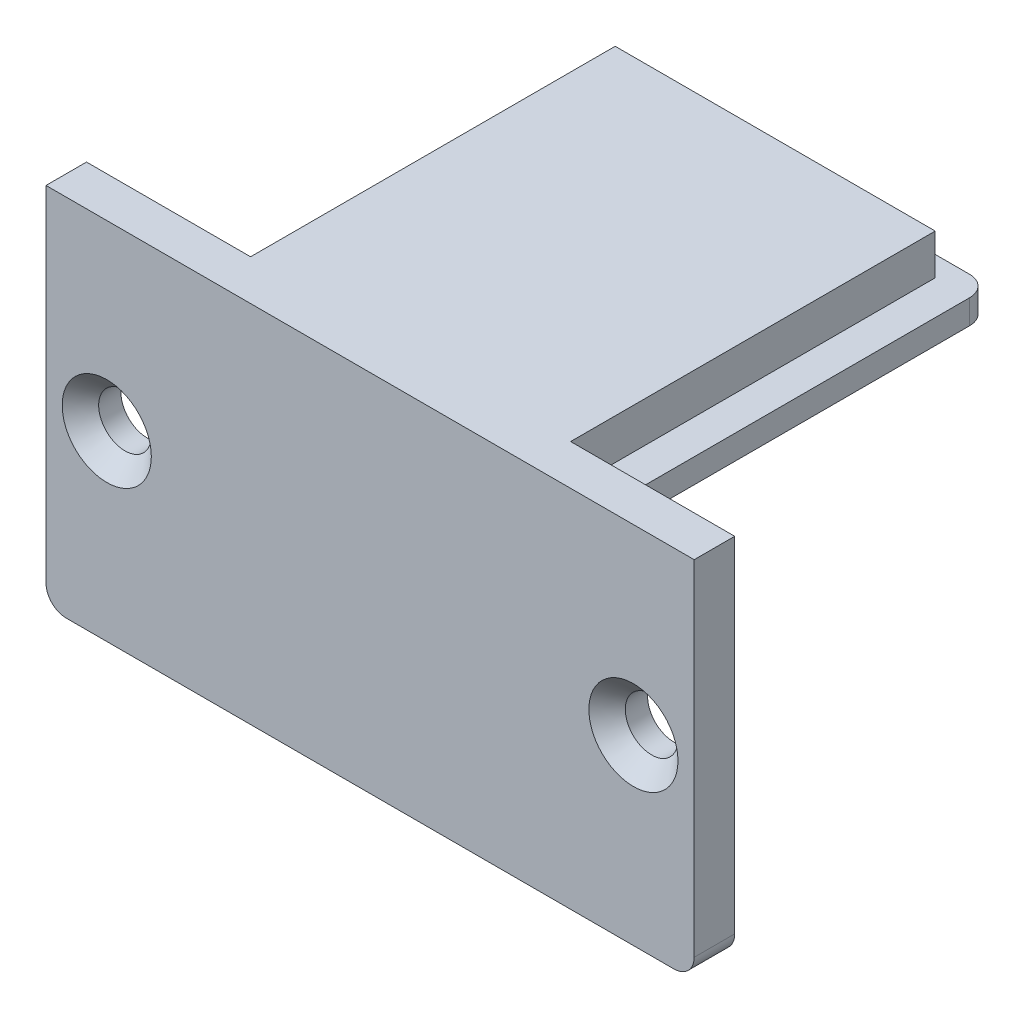
ISO-10303-21;
HEADER;
FILE_DESCRIPTION(('STEP AP214'),'2;1');
FILE_NAME('part.step','',(''),(''),'','','');
FILE_SCHEMA(('AUTOMOTIVE_DESIGN { 1 0 10303 214 1 1 1 1 }'));
ENDSEC;
DATA;
#1=APPLICATION_CONTEXT('core data for automotive mechanical design processes');
#2=APPLICATION_PROTOCOL_DEFINITION('international standard','automotive_design',2000,#1);
#3=PRODUCT_CONTEXT('',#1,'mechanical');
#4=PRODUCT('Part','Part','',(#3));
#5=PRODUCT_RELATED_PRODUCT_CATEGORY('part','',(#4));
#6=PRODUCT_DEFINITION_FORMATION('','',#4);
#7=PRODUCT_DEFINITION_CONTEXT('part definition',#1,'design');
#8=PRODUCT_DEFINITION('design','',#6,#7);
#9=PRODUCT_DEFINITION_SHAPE('','',#8);
#10=(LENGTH_UNIT() NAMED_UNIT(*) SI_UNIT(.MILLI.,.METRE.));
#11=(NAMED_UNIT(*) PLANE_ANGLE_UNIT() SI_UNIT($,.RADIAN.));
#12=(NAMED_UNIT(*) SI_UNIT($,.STERADIAN.) SOLID_ANGLE_UNIT());
#13=UNCERTAINTY_MEASURE_WITH_UNIT(LENGTH_MEASURE(1.E-05),#10,'distance_accuracy_value','');
#14=(GEOMETRIC_REPRESENTATION_CONTEXT(3) GLOBAL_UNCERTAINTY_ASSIGNED_CONTEXT((#13)) GLOBAL_UNIT_ASSIGNED_CONTEXT((#10,
#11,#12)) REPRESENTATION_CONTEXT('',''));
#15=CARTESIAN_POINT('',(0.,0.,0.));
#16=DIRECTION('',(0.,0.,1.));
#17=DIRECTION('',(1.,0.,0.));
#18=AXIS2_PLACEMENT_3D('',#15,#16,#17);
#19=CARTESIAN_POINT('',(0.,0.,0.));
#20=DIRECTION('',(0.,0.,-1.));
#21=DIRECTION('',(-1.,0.,0.));
#22=AXIS2_PLACEMENT_3D('',#19,#20,#21);
#23=PLANE('',#22);
#24=DIRECTION('',(0.,1.,0.));
#25=VECTOR('',#24,1.);
#26=CARTESIAN_POINT('',(16.,-9.,0.));
#27=LINE('',#26,#25);
#28=CARTESIAN_POINT('',(16.,-8.,0.));
#29=VERTEX_POINT('',#28);
#30=CARTESIAN_POINT('',(16.,9.,0.));
#31=VERTEX_POINT('',#30);
#32=EDGE_CURVE('E271',#29,#31,#27,.T.);
#33=ORIENTED_EDGE('',*,*,#32,.F.);
#34=CARTESIAN_POINT('',(15.,-8.,0.));
#35=DIRECTION('',(0.,0.,-1.));
#36=DIRECTION('',(-1.,0.,0.));
#37=AXIS2_PLACEMENT_3D('',#34,#35,#36);
#38=CIRCLE('',#37,1.);
#39=CARTESIAN_POINT('',(15.,-9.,0.));
#40=VERTEX_POINT('',#39);
#41=EDGE_CURVE('E311',#29,#40,#38,.T.);
#42=ORIENTED_EDGE('',*,*,#41,.T.);
#43=DIRECTION('',(1.,0.,0.));
#44=VECTOR('',#43,1.);
#45=CARTESIAN_POINT('',(-16.,-9.,0.));
#46=LINE('',#45,#44);
#47=CARTESIAN_POINT('',(-15.,-9.,0.));
#48=VERTEX_POINT('',#47);
#49=EDGE_CURVE('E275',#48,#40,#46,.T.);
#50=ORIENTED_EDGE('',*,*,#49,.F.);
#51=CARTESIAN_POINT('',(-15.,-8.,0.));
#52=DIRECTION('',(0.,0.,-1.));
#53=DIRECTION('',(-1.,0.,0.));
#54=AXIS2_PLACEMENT_3D('',#51,#52,#53);
#55=CIRCLE('',#54,1.);
#56=CARTESIAN_POINT('',(-16.,-8.,0.));
#57=VERTEX_POINT('',#56);
#58=EDGE_CURVE('E309',#48,#57,#55,.T.);
#59=ORIENTED_EDGE('',*,*,#58,.T.);
#60=DIRECTION('',(0.,-1.,0.));
#61=VECTOR('',#60,1.);
#62=CARTESIAN_POINT('',(-16.,-9.,0.));
#63=LINE('',#62,#61);
#64=CARTESIAN_POINT('',(-16.,9.,0.));
#65=VERTEX_POINT('',#64);
#66=EDGE_CURVE('E289',#65,#57,#63,.T.);
#67=ORIENTED_EDGE('',*,*,#66,.F.);
#68=DIRECTION('',(-1.,0.,0.));
#69=VECTOR('',#68,1.);
#70=CARTESIAN_POINT('',(-16.,9.,0.));
#71=LINE('',#70,#69);
#72=CARTESIAN_POINT('',(-7.9,9.,0.));
#73=VERTEX_POINT('',#72);
#74=EDGE_CURVE('E285',#73,#65,#71,.T.);
#75=ORIENTED_EDGE('',*,*,#74,.F.);
#76=DIRECTION('',(0.,1.,0.));
#77=VECTOR('',#76,1.);
#78=CARTESIAN_POINT('',(-7.9,9.,0.));
#79=LINE('',#78,#77);
#80=CARTESIAN_POINT('',(-7.9,7.,0.));
#81=VERTEX_POINT('',#80);
#82=EDGE_CURVE('E207',#81,#73,#79,.T.);
#83=ORIENTED_EDGE('',*,*,#82,.F.);
#84=DIRECTION('',(1.,0.,0.));
#85=VECTOR('',#84,1.);
#86=CARTESIAN_POINT('',(9.5,7.,0.));
#87=LINE('',#86,#85);
#88=CARTESIAN_POINT('',(-9.6,6.99999999999999,0.));
#89=VERTEX_POINT('',#88);
#90=EDGE_CURVE('E200',#89,#81,#87,.T.);
#91=ORIENTED_EDGE('',*,*,#90,.F.);
#92=DIRECTION('',(0.,1.,0.));
#93=VECTOR('',#92,1.);
#94=CARTESIAN_POINT('',(-9.6,0.,0.));
#95=LINE('',#94,#93);
#96=CARTESIAN_POINT('',(-9.6,5.8,0.));
#97=VERTEX_POINT('',#96);
#98=EDGE_CURVE('E208',#97,#89,#95,.T.);
#99=ORIENTED_EDGE('',*,*,#98,.F.);
#100=DIRECTION('',(-1.,0.,0.));
#101=VECTOR('',#100,1.);
#102=CARTESIAN_POINT('',(0.,5.8,0.));
#103=LINE('',#102,#101);
#104=CARTESIAN_POINT('',(-9.5,5.8,0.));
#105=VERTEX_POINT('',#104);
#106=EDGE_CURVE('E354',#105,#97,#103,.T.);
#107=ORIENTED_EDGE('',*,*,#106,.F.);
#108=DIRECTION('',(0.,1.,0.));
#109=VECTOR('',#108,1.);
#110=CARTESIAN_POINT('',(-9.5,-7.,0.));
#111=LINE('',#110,#109);
#112=CARTESIAN_POINT('',(-9.5,-7.,0.));
#113=VERTEX_POINT('',#112);
#114=EDGE_CURVE('E201',#113,#105,#111,.T.);
#115=ORIENTED_EDGE('',*,*,#114,.F.);
#116=DIRECTION('',(-1.,0.,0.));
#117=VECTOR('',#116,1.);
#118=CARTESIAN_POINT('',(9.5,-7.,0.));
#119=LINE('',#118,#117);
#120=CARTESIAN_POINT('',(9.5,-7.,0.));
#121=VERTEX_POINT('',#120);
#122=EDGE_CURVE('E254',#121,#113,#119,.T.);
#123=ORIENTED_EDGE('',*,*,#122,.F.);
#124=DIRECTION('',(0.,-1.,0.));
#125=VECTOR('',#124,1.);
#126=CARTESIAN_POINT('',(9.5,-7.,0.));
#127=LINE('',#126,#125);
#128=CARTESIAN_POINT('',(9.5,5.8,0.));
#129=VERTEX_POINT('',#128);
#130=EDGE_CURVE('E262',#129,#121,#127,.T.);
#131=ORIENTED_EDGE('',*,*,#130,.F.);
#132=CARTESIAN_POINT('',(9.6,5.8,0.));
#133=VERTEX_POINT('',#132);
#134=EDGE_CURVE('E206',#133,#129,#103,.T.);
#135=ORIENTED_EDGE('',*,*,#134,.F.);
#136=DIRECTION('',(0.,-1.,0.));
#137=VECTOR('',#136,1.);
#138=CARTESIAN_POINT('',(9.6,0.,0.));
#139=LINE('',#138,#137);
#140=CARTESIAN_POINT('',(9.6,7.,0.));
#141=VERTEX_POINT('',#140);
#142=EDGE_CURVE('E184',#141,#133,#139,.T.);
#143=ORIENTED_EDGE('',*,*,#142,.F.);
#144=CARTESIAN_POINT('',(7.9,7.,0.));
#145=VERTEX_POINT('',#144);
#146=EDGE_CURVE('E193',#145,#141,#87,.T.);
#147=ORIENTED_EDGE('',*,*,#146,.F.);
#148=DIRECTION('',(0.,-1.,0.));
#149=VECTOR('',#148,1.);
#150=CARTESIAN_POINT('',(7.90000000000001,9.,0.));
#151=LINE('',#150,#149);
#152=CARTESIAN_POINT('',(7.90000000000001,9.,0.));
#153=VERTEX_POINT('',#152);
#154=EDGE_CURVE('E211',#153,#145,#151,.T.);
#155=ORIENTED_EDGE('',*,*,#154,.F.);
#156=EDGE_CURVE('E286',#31,#153,#71,.T.);
#157=ORIENTED_EDGE('',*,*,#156,.F.);
#158=EDGE_LOOP('',(#33,#42,#50,#59,#67,#75,#83,#91,#99,#107,#115,#123,#131,#135,#143,#147,#155,#157));
#159=FACE_BOUND('',#158,.T.);
#160=CARTESIAN_POINT('',(13.,0.,0.));
#161=DIRECTION('',(0.,0.,-1.));
#162=DIRECTION('',(-1.,0.,0.));
#163=AXIS2_PLACEMENT_3D('',#160,#161,#162);
#164=CIRCLE('',#163,1.3);
#165=CARTESIAN_POINT('',(11.7,0.,0.));
#166=VERTEX_POINT('',#165);
#167=EDGE_CURVE('E242',#166,#166,#164,.T.);
#168=ORIENTED_EDGE('',*,*,#167,.F.);
#169=EDGE_LOOP('',(#168));
#170=FACE_BOUND('',#169,.T.);
#171=CARTESIAN_POINT('',(-13.,0.,0.));
#172=DIRECTION('',(0.,0.,-1.));
#173=DIRECTION('',(-1.,0.,0.));
#174=AXIS2_PLACEMENT_3D('',#171,#172,#173);
#175=CIRCLE('',#174,1.3);
#176=CARTESIAN_POINT('',(-14.3,0.,0.));
#177=VERTEX_POINT('',#176);
#178=EDGE_CURVE('E249',#177,#177,#175,.T.);
#179=ORIENTED_EDGE('',*,*,#178,.F.);
#180=EDGE_LOOP('',(#179));
#181=FACE_BOUND('',#180,.T.);
#182=ADVANCED_FACE('F39',(#159,#170,#181),#23,.T.);
#183=CARTESIAN_POINT('',(9.5,7.,-1.4));
#184=DIRECTION('',(0.,-1.,0.));
#185=DIRECTION('',(0.,0.,-1.));
#186=AXIS2_PLACEMENT_3D('',#183,#184,#185);
#187=PLANE('',#186);
#188=DIRECTION('',(0.,0.,1.));
#189=VECTOR('',#188,1.);
#190=CARTESIAN_POINT('',(9.6,7.,-19.));
#191=LINE('',#190,#189);
#192=CARTESIAN_POINT('',(9.6,7.,-18.));
#193=VERTEX_POINT('',#192);
#194=EDGE_CURVE('E179',#193,#141,#191,.T.);
#195=ORIENTED_EDGE('',*,*,#194,.F.);
#196=CARTESIAN_POINT('',(8.6,7.,-18.));
#197=DIRECTION('',(0.,-1.,0.));
#198=DIRECTION('',(0.,0.,-1.));
#199=AXIS2_PLACEMENT_3D('',#196,#197,#198);
#200=CIRCLE('',#199,1.);
#201=CARTESIAN_POINT('',(8.6,7.,-19.));
#202=VERTEX_POINT('',#201);
#203=EDGE_CURVE('E327',#193,#202,#200,.F.);
#204=ORIENTED_EDGE('',*,*,#203,.T.);
#205=DIRECTION('',(-1.,0.,0.));
#206=VECTOR('',#205,1.);
#207=CARTESIAN_POINT('',(9.6,7.,-19.));
#208=LINE('',#207,#206);
#209=CARTESIAN_POINT('',(-8.6,6.99999999999999,-19.));
#210=VERTEX_POINT('',#209);
#211=EDGE_CURVE('E342',#202,#210,#208,.T.);
#212=ORIENTED_EDGE('',*,*,#211,.T.);
#213=CARTESIAN_POINT('',(-8.6,7.,-18.));
#214=DIRECTION('',(0.,-1.,0.));
#215=DIRECTION('',(0.,0.,-1.));
#216=AXIS2_PLACEMENT_3D('',#213,#214,#215);
#217=CIRCLE('',#216,1.);
#218=CARTESIAN_POINT('',(-9.6,6.99999999999999,-18.));
#219=VERTEX_POINT('',#218);
#220=EDGE_CURVE('E325',#210,#219,#217,.F.);
#221=ORIENTED_EDGE('',*,*,#220,.T.);
#222=DIRECTION('',(0.,0.,1.));
#223=VECTOR('',#222,1.);
#224=CARTESIAN_POINT('',(-9.6,6.99999999999999,-19.));
#225=LINE('',#224,#223);
#226=EDGE_CURVE('E189',#219,#89,#225,.T.);
#227=ORIENTED_EDGE('',*,*,#226,.T.);
#228=ORIENTED_EDGE('',*,*,#90,.T.);
#229=DIRECTION('',(0.,0.,1.));
#230=VECTOR('',#229,1.);
#231=CARTESIAN_POINT('',(-7.9,7.,-18.));
#232=LINE('',#231,#230);
#233=CARTESIAN_POINT('',(-7.9,7.,-18.));
#234=VERTEX_POINT('',#233);
#235=EDGE_CURVE('E227',#234,#81,#232,.T.);
#236=ORIENTED_EDGE('',*,*,#235,.F.);
#237=DIRECTION('',(-1.,0.,0.));
#238=VECTOR('',#237,1.);
#239=CARTESIAN_POINT('',(7.9,7.,-18.));
#240=LINE('',#239,#238);
#241=CARTESIAN_POINT('',(7.90000000000001,7.,-18.));
#242=VERTEX_POINT('',#241);
#243=EDGE_CURVE('E225',#242,#234,#240,.T.);
#244=ORIENTED_EDGE('',*,*,#243,.F.);
#245=DIRECTION('',(0.,0.,1.));
#246=VECTOR('',#245,1.);
#247=CARTESIAN_POINT('',(7.9,7.,-18.));
#248=LINE('',#247,#246);
#249=EDGE_CURVE('E196',#242,#145,#248,.T.);
#250=ORIENTED_EDGE('',*,*,#249,.T.);
#251=ORIENTED_EDGE('',*,*,#146,.T.);
#252=EDGE_LOOP('',(#195,#204,#212,#221,#227,#228,#236,#244,#250,#251));
#253=FACE_BOUND('',#252,.T.);
#254=ADVANCED_FACE('F194',(#253),#187,.F.);
#255=CARTESIAN_POINT('',(16.,-9.,2.));
#256=DIRECTION('',(-1.,0.,0.));
#257=DIRECTION('',(0.,0.,1.));
#258=AXIS2_PLACEMENT_3D('',#255,#256,#257);
#259=PLANE('',#258);
#260=DIRECTION('',(0.,1.,0.));
#261=VECTOR('',#260,1.);
#262=CARTESIAN_POINT('',(16.,-9.,2.));
#263=LINE('',#262,#261);
#264=CARTESIAN_POINT('',(16.,-8.,2.));
#265=VERTEX_POINT('',#264);
#266=CARTESIAN_POINT('',(16.,9.,2.));
#267=VERTEX_POINT('',#266);
#268=EDGE_CURVE('E272',#265,#267,#263,.T.);
#269=ORIENTED_EDGE('',*,*,#268,.F.);
#270=DIRECTION('',(0.,0.,-1.));
#271=VECTOR('',#270,1.);
#272=CARTESIAN_POINT('',(16.,-8.,2.));
#273=LINE('',#272,#271);
#274=EDGE_CURVE('E306',#265,#29,#273,.T.);
#275=ORIENTED_EDGE('',*,*,#274,.T.);
#276=ORIENTED_EDGE('',*,*,#32,.T.);
#277=DIRECTION('',(0.,0.,-1.));
#278=VECTOR('',#277,1.);
#279=CARTESIAN_POINT('',(16.,9.,2.));
#280=LINE('',#279,#278);
#281=EDGE_CURVE('E296',#267,#31,#280,.T.);
#282=ORIENTED_EDGE('',*,*,#281,.F.);
#283=EDGE_LOOP('',(#269,#275,#276,#282));
#284=FACE_BOUND('',#283,.T.);
#285=ADVANCED_FACE('F392',(#284),#259,.F.);
#286=CARTESIAN_POINT('',(-16.,9.,2.));
#287=DIRECTION('',(0.,-1.,0.));
#288=DIRECTION('',(0.,0.,-1.));
#289=AXIS2_PLACEMENT_3D('',#286,#287,#288);
#290=PLANE('',#289);
#291=ORIENTED_EDGE('',*,*,#156,.T.);
#292=DIRECTION('',(0.,0.,1.));
#293=VECTOR('',#292,1.);
#294=CARTESIAN_POINT('',(7.90000000000001,9.,-18.));
#295=LINE('',#294,#293);
#296=CARTESIAN_POINT('',(7.90000000000001,9.,-18.));
#297=VERTEX_POINT('',#296);
#298=EDGE_CURVE('E232',#297,#153,#295,.T.);
#299=ORIENTED_EDGE('',*,*,#298,.F.);
#300=DIRECTION('',(1.,0.,0.));
#301=VECTOR('',#300,1.);
#302=CARTESIAN_POINT('',(7.90000000000001,9.,-18.));
#303=LINE('',#302,#301);
#304=CARTESIAN_POINT('',(-7.9,9.,-18.));
#305=VERTEX_POINT('',#304);
#306=EDGE_CURVE('E220',#305,#297,#303,.T.);
#307=ORIENTED_EDGE('',*,*,#306,.F.);
#308=DIRECTION('',(0.,0.,1.));
#309=VECTOR('',#308,1.);
#310=CARTESIAN_POINT('',(-7.9,9.,-18.));
#311=LINE('',#310,#309);
#312=EDGE_CURVE('E234',#305,#73,#311,.T.);
#313=ORIENTED_EDGE('',*,*,#312,.T.);
#314=ORIENTED_EDGE('',*,*,#74,.T.);
#315=DIRECTION('',(0.,0.,-1.));
#316=VECTOR('',#315,1.);
#317=CARTESIAN_POINT('',(-16.,9.,2.));
#318=LINE('',#317,#316);
#319=CARTESIAN_POINT('',(-16.,9.,2.));
#320=VERTEX_POINT('',#319);
#321=EDGE_CURVE('E283',#320,#65,#318,.T.);
#322=ORIENTED_EDGE('',*,*,#321,.F.);
#323=DIRECTION('',(-1.,0.,0.));
#324=VECTOR('',#323,1.);
#325=CARTESIAN_POINT('',(-16.,9.,2.));
#326=LINE('',#325,#324);
#327=EDGE_CURVE('E274',#267,#320,#326,.T.);
#328=ORIENTED_EDGE('',*,*,#327,.F.);
#329=ORIENTED_EDGE('',*,*,#281,.T.);
#330=EDGE_LOOP('',(#291,#299,#307,#313,#314,#322,#328,#329));
#331=FACE_BOUND('',#330,.T.);
#332=ADVANCED_FACE('F400',(#331),#290,.F.);
#333=CARTESIAN_POINT('',(-16.,-9.,2.));
#334=DIRECTION('',(1.,0.,0.));
#335=DIRECTION('',(0.,0.,-1.));
#336=AXIS2_PLACEMENT_3D('',#333,#334,#335);
#337=PLANE('',#336);
#338=ORIENTED_EDGE('',*,*,#66,.T.);
#339=DIRECTION('',(0.,0.,-1.));
#340=VECTOR('',#339,1.);
#341=CARTESIAN_POINT('',(-16.,-8.,2.));
#342=LINE('',#341,#340);
#343=CARTESIAN_POINT('',(-16.,-8.,2.));
#344=VERTEX_POINT('',#343);
#345=EDGE_CURVE('E322',#57,#344,#342,.F.);
#346=ORIENTED_EDGE('',*,*,#345,.T.);
#347=DIRECTION('',(0.,-1.,0.));
#348=VECTOR('',#347,1.);
#349=CARTESIAN_POINT('',(-16.,-9.,2.));
#350=LINE('',#349,#348);
#351=EDGE_CURVE('E277',#320,#344,#350,.T.);
#352=ORIENTED_EDGE('',*,*,#351,.F.);
#353=ORIENTED_EDGE('',*,*,#321,.T.);
#354=EDGE_LOOP('',(#338,#346,#352,#353));
#355=FACE_BOUND('',#354,.T.);
#356=ADVANCED_FACE('F396',(#355),#337,.F.);
#357=CARTESIAN_POINT('',(-16.,-9.,2.));
#358=DIRECTION('',(0.,1.,0.));
#359=DIRECTION('',(0.,0.,1.));
#360=AXIS2_PLACEMENT_3D('',#357,#358,#359);
#361=PLANE('',#360);
#362=ORIENTED_EDGE('',*,*,#49,.T.);
#363=DIRECTION('',(0.,0.,-1.));
#364=VECTOR('',#363,1.);
#365=CARTESIAN_POINT('',(15.,-9.,2.));
#366=LINE('',#365,#364);
#367=CARTESIAN_POINT('',(15.,-9.,2.));
#368=VERTEX_POINT('',#367);
#369=EDGE_CURVE('E316',#40,#368,#366,.F.);
#370=ORIENTED_EDGE('',*,*,#369,.T.);
#371=DIRECTION('',(1.,0.,0.));
#372=VECTOR('',#371,1.);
#373=CARTESIAN_POINT('',(-16.,-9.,2.));
#374=LINE('',#373,#372);
#375=CARTESIAN_POINT('',(-15.,-9.,2.));
#376=VERTEX_POINT('',#375);
#377=EDGE_CURVE('E280',#376,#368,#374,.T.);
#378=ORIENTED_EDGE('',*,*,#377,.F.);
#379=DIRECTION('',(0.,0.,-1.));
#380=VECTOR('',#379,1.);
#381=CARTESIAN_POINT('',(-15.,-9.,2.));
#382=LINE('',#381,#380);
#383=EDGE_CURVE('E313',#376,#48,#382,.T.);
#384=ORIENTED_EDGE('',*,*,#383,.T.);
#385=EDGE_LOOP('',(#362,#370,#378,#384));
#386=FACE_BOUND('',#385,.T.);
#387=ADVANCED_FACE('F382',(#386),#361,.F.);
#388=CARTESIAN_POINT('',(0.,0.,2.));
#389=DIRECTION('',(0.,0.,-1.));
#390=DIRECTION('',(-1.,0.,0.));
#391=AXIS2_PLACEMENT_3D('',#388,#389,#390);
#392=PLANE('',#391);
#393=CARTESIAN_POINT('',(13.,0.,2.));
#394=DIRECTION('',(0.,0.,1.));
#395=DIRECTION('',(1.,0.,0.));
#396=AXIS2_PLACEMENT_3D('',#393,#394,#395);
#397=CIRCLE('',#396,2.2);
#398=CARTESIAN_POINT('',(15.2,0.,2.));
#399=VERTEX_POINT('',#398);
#400=EDGE_CURVE('E236',#399,#399,#397,.T.);
#401=ORIENTED_EDGE('',*,*,#400,.F.);
#402=EDGE_LOOP('',(#401));
#403=FACE_BOUND('',#402,.T.);
#404=CARTESIAN_POINT('',(-13.,0.,2.));
#405=DIRECTION('',(0.,0.,1.));
#406=DIRECTION('',(1.,0.,0.));
#407=AXIS2_PLACEMENT_3D('',#404,#405,#406);
#408=CIRCLE('',#407,2.2);
#409=CARTESIAN_POINT('',(-10.8,0.,2.));
#410=VERTEX_POINT('',#409);
#411=EDGE_CURVE('E243',#410,#410,#408,.T.);
#412=ORIENTED_EDGE('',*,*,#411,.F.);
#413=EDGE_LOOP('',(#412));
#414=FACE_BOUND('',#413,.T.);
#415=ORIENTED_EDGE('',*,*,#377,.T.);
#416=CARTESIAN_POINT('',(15.,-8.,2.));
#417=DIRECTION('',(0.,0.,-1.));
#418=DIRECTION('',(-1.,0.,0.));
#419=AXIS2_PLACEMENT_3D('',#416,#417,#418);
#420=CIRCLE('',#419,1.);
#421=EDGE_CURVE('E320',#368,#265,#420,.F.);
#422=ORIENTED_EDGE('',*,*,#421,.T.);
#423=ORIENTED_EDGE('',*,*,#268,.T.);
#424=ORIENTED_EDGE('',*,*,#327,.T.);
#425=ORIENTED_EDGE('',*,*,#351,.T.);
#426=CARTESIAN_POINT('',(-15.,-8.,2.));
#427=DIRECTION('',(0.,0.,-1.));
#428=DIRECTION('',(-1.,0.,0.));
#429=AXIS2_PLACEMENT_3D('',#426,#427,#428);
#430=CIRCLE('',#429,1.);
#431=EDGE_CURVE('E318',#344,#376,#430,.F.);
#432=ORIENTED_EDGE('',*,*,#431,.T.);
#433=EDGE_LOOP('',(#415,#422,#423,#424,#425,#432));
#434=FACE_BOUND('',#433,.T.);
#435=ADVANCED_FACE('F374',(#403,#414,#434),#392,.F.);
#436=CARTESIAN_POINT('',(-9.5,-7.,-1.4));
#437=DIRECTION('',(1.,0.,0.));
#438=DIRECTION('',(0.,0.,-1.));
#439=AXIS2_PLACEMENT_3D('',#436,#437,#438);
#440=PLANE('',#439);
#441=ORIENTED_EDGE('',*,*,#114,.T.);
#442=DIRECTION('',(0.,0.,-1.));
#443=VECTOR('',#442,1.);
#444=CARTESIAN_POINT('',(-9.5,5.8,-1.4));
#445=LINE('',#444,#443);
#446=CARTESIAN_POINT('',(-9.5,5.8,-1.4));
#447=VERTEX_POINT('',#446);
#448=EDGE_CURVE('E352',#105,#447,#445,.T.);
#449=ORIENTED_EDGE('',*,*,#448,.T.);
#450=DIRECTION('',(0.,1.,0.));
#451=VECTOR('',#450,1.);
#452=CARTESIAN_POINT('',(-9.5,-7.,-1.4));
#453=LINE('',#452,#451);
#454=CARTESIAN_POINT('',(-9.5,-7.,-1.4));
#455=VERTEX_POINT('',#454);
#456=EDGE_CURVE('E250',#455,#447,#453,.T.);
#457=ORIENTED_EDGE('',*,*,#456,.F.);
#458=DIRECTION('',(0.,0.,1.));
#459=VECTOR('',#458,1.);
#460=CARTESIAN_POINT('',(-9.5,-7.,-1.4));
#461=LINE('',#460,#459);
#462=EDGE_CURVE('E258',#455,#113,#461,.T.);
#463=ORIENTED_EDGE('',*,*,#462,.T.);
#464=EDGE_LOOP('',(#441,#449,#457,#463));
#465=FACE_BOUND('',#464,.T.);
#466=ADVANCED_FACE('F372',(#465),#440,.F.);
#467=CARTESIAN_POINT('',(9.5,-7.,-1.4));
#468=DIRECTION('',(-1.,0.,0.));
#469=DIRECTION('',(0.,0.,1.));
#470=AXIS2_PLACEMENT_3D('',#467,#468,#469);
#471=PLANE('',#470);
#472=DIRECTION('',(0.,-1.,0.));
#473=VECTOR('',#472,1.);
#474=CARTESIAN_POINT('',(9.5,-7.,-1.4));
#475=LINE('',#474,#473);
#476=CARTESIAN_POINT('',(9.5,5.8,-1.4));
#477=VERTEX_POINT('',#476);
#478=CARTESIAN_POINT('',(9.5,-7.,-1.4));
#479=VERTEX_POINT('',#478);
#480=EDGE_CURVE('E253',#477,#479,#475,.T.);
#481=ORIENTED_EDGE('',*,*,#480,.F.);
#482=DIRECTION('',(0.,0.,1.));
#483=VECTOR('',#482,1.);
#484=CARTESIAN_POINT('',(9.5,5.8,-1.4));
#485=LINE('',#484,#483);
#486=EDGE_CURVE('E337',#477,#129,#485,.T.);
#487=ORIENTED_EDGE('',*,*,#486,.T.);
#488=ORIENTED_EDGE('',*,*,#130,.T.);
#489=DIRECTION('',(0.,0.,1.));
#490=VECTOR('',#489,1.);
#491=CARTESIAN_POINT('',(9.5,-7.,-1.4));
#492=LINE('',#491,#490);
#493=EDGE_CURVE('E268',#479,#121,#492,.T.);
#494=ORIENTED_EDGE('',*,*,#493,.F.);
#495=EDGE_LOOP('',(#481,#487,#488,#494));
#496=FACE_BOUND('',#495,.T.);
#497=ADVANCED_FACE('F361',(#496),#471,.F.);
#498=CARTESIAN_POINT('',(9.5,-7.,-1.4));
#499=DIRECTION('',(0.,1.,0.));
#500=DIRECTION('',(0.,0.,1.));
#501=AXIS2_PLACEMENT_3D('',#498,#499,#500);
#502=PLANE('',#501);
#503=ORIENTED_EDGE('',*,*,#122,.T.);
#504=ORIENTED_EDGE('',*,*,#462,.F.);
#505=DIRECTION('',(-1.,0.,0.));
#506=VECTOR('',#505,1.);
#507=CARTESIAN_POINT('',(9.5,-7.,-1.4));
#508=LINE('',#507,#506);
#509=EDGE_CURVE('E256',#479,#455,#508,.T.);
#510=ORIENTED_EDGE('',*,*,#509,.F.);
#511=ORIENTED_EDGE('',*,*,#493,.T.);
#512=EDGE_LOOP('',(#503,#504,#510,#511));
#513=FACE_BOUND('',#512,.T.);
#514=ADVANCED_FACE('F367',(#513),#502,.F.);
#515=CARTESIAN_POINT('',(0.,0.,-1.4));
#516=DIRECTION('',(0.,0.,1.));
#517=DIRECTION('',(1.,0.,0.));
#518=AXIS2_PLACEMENT_3D('',#515,#516,#517);
#519=PLANE('',#518);
#520=ORIENTED_EDGE('',*,*,#456,.T.);
#521=DIRECTION('',(1.,0.,0.));
#522=VECTOR('',#521,1.);
#523=CARTESIAN_POINT('',(0.,5.8,-1.4));
#524=LINE('',#523,#522);
#525=EDGE_CURVE('E299',#447,#477,#524,.T.);
#526=ORIENTED_EDGE('',*,*,#525,.T.);
#527=ORIENTED_EDGE('',*,*,#480,.T.);
#528=ORIENTED_EDGE('',*,*,#509,.T.);
#529=EDGE_LOOP('',(#520,#526,#527,#528));
#530=FACE_BOUND('',#529,.T.);
#531=ADVANCED_FACE('F370',(#530),#519,.F.);
#532=CARTESIAN_POINT('',(-13.,0.,2.));
#533=DIRECTION('',(0.,0.,1.));
#534=DIRECTION('',(1.,0.,0.));
#535=AXIS2_PLACEMENT_3D('',#532,#533,#534);
#536=CYLINDRICAL_SURFACE('',#535,1.3);
#537=ORIENTED_EDGE('',*,*,#178,.T.);
#538=EDGE_LOOP('',(#537));
#539=FACE_BOUND('',#538,.T.);
#540=CARTESIAN_POINT('',(-13.,0.,1.1));
#541=DIRECTION('',(0.,0.,1.));
#542=DIRECTION('',(1.,0.,0.));
#543=AXIS2_PLACEMENT_3D('',#540,#541,#542);
#544=CIRCLE('',#543,1.3);
#545=CARTESIAN_POINT('',(-11.7,0.,1.1));
#546=VERTEX_POINT('',#545);
#547=EDGE_CURVE('E246',#546,#546,#544,.T.);
#548=ORIENTED_EDGE('',*,*,#547,.T.);
#549=EDGE_LOOP('',(#548));
#550=FACE_BOUND('',#549,.T.);
#551=ADVANCED_FACE('F472',(#539,#550),#536,.F.);
#552=CARTESIAN_POINT('',(-13.,0.,2.));
#553=DIRECTION('',(0.,0.,1.));
#554=DIRECTION('',(1.,0.,0.));
#555=AXIS2_PLACEMENT_3D('',#552,#553,#554);
#556=CONICAL_SURFACE('',#555,2.2,0.785398163397449);
#557=ORIENTED_EDGE('',*,*,#547,.F.);
#558=EDGE_LOOP('',(#557));
#559=FACE_BOUND('',#558,.T.);
#560=ORIENTED_EDGE('',*,*,#411,.T.);
#561=EDGE_LOOP('',(#560));
#562=FACE_BOUND('',#561,.T.);
#563=ADVANCED_FACE('F468',(#559,#562),#556,.F.);
#564=CARTESIAN_POINT('',(13.,0.,2.));
#565=DIRECTION('',(0.,0.,1.));
#566=DIRECTION('',(1.,0.,0.));
#567=AXIS2_PLACEMENT_3D('',#564,#565,#566);
#568=CYLINDRICAL_SURFACE('',#567,1.3);
#569=ORIENTED_EDGE('',*,*,#167,.T.);
#570=EDGE_LOOP('',(#569));
#571=FACE_BOUND('',#570,.T.);
#572=CARTESIAN_POINT('',(13.,0.,1.1));
#573=DIRECTION('',(0.,0.,1.));
#574=DIRECTION('',(1.,0.,0.));
#575=AXIS2_PLACEMENT_3D('',#572,#573,#574);
#576=CIRCLE('',#575,1.3);
#577=CARTESIAN_POINT('',(14.3,0.,1.1));
#578=VERTEX_POINT('',#577);
#579=EDGE_CURVE('E239',#578,#578,#576,.T.);
#580=ORIENTED_EDGE('',*,*,#579,.T.);
#581=EDGE_LOOP('',(#580));
#582=FACE_BOUND('',#581,.T.);
#583=ADVANCED_FACE('F464',(#571,#582),#568,.F.);
#584=CARTESIAN_POINT('',(13.,0.,2.));
#585=DIRECTION('',(0.,0.,1.));
#586=DIRECTION('',(1.,0.,0.));
#587=AXIS2_PLACEMENT_3D('',#584,#585,#586);
#588=CONICAL_SURFACE('',#587,2.2,0.785398163397449);
#589=ORIENTED_EDGE('',*,*,#579,.F.);
#590=EDGE_LOOP('',(#589));
#591=FACE_BOUND('',#590,.T.);
#592=ORIENTED_EDGE('',*,*,#400,.T.);
#593=EDGE_LOOP('',(#592));
#594=FACE_BOUND('',#593,.T.);
#595=ADVANCED_FACE('F458',(#591,#594),#588,.F.);
#596=CARTESIAN_POINT('',(-7.9,9.,-18.));
#597=DIRECTION('',(1.,0.,0.));
#598=DIRECTION('',(0.,0.,-1.));
#599=AXIS2_PLACEMENT_3D('',#596,#597,#598);
#600=PLANE('',#599);
#601=ORIENTED_EDGE('',*,*,#82,.T.);
#602=ORIENTED_EDGE('',*,*,#312,.F.);
#603=DIRECTION('',(0.,1.,0.));
#604=VECTOR('',#603,1.);
#605=CARTESIAN_POINT('',(-7.9,9.,-18.));
#606=LINE('',#605,#604);
#607=EDGE_CURVE('E217',#234,#305,#606,.T.);
#608=ORIENTED_EDGE('',*,*,#607,.F.);
#609=ORIENTED_EDGE('',*,*,#235,.T.);
#610=EDGE_LOOP('',(#601,#602,#608,#609));
#611=FACE_BOUND('',#610,.T.);
#612=ADVANCED_FACE('F432',(#611),#600,.F.);
#613=CARTESIAN_POINT('',(7.90000000000001,9.,-18.));
#614=DIRECTION('',(-1.,0.,0.));
#615=DIRECTION('',(0.,-1.,0.));
#616=AXIS2_PLACEMENT_3D('',#613,#614,#615);
#617=PLANE('',#616);
#618=ORIENTED_EDGE('',*,*,#154,.T.);
#619=ORIENTED_EDGE('',*,*,#249,.F.);
#620=DIRECTION('',(0.,-1.,0.));
#621=VECTOR('',#620,1.);
#622=CARTESIAN_POINT('',(7.90000000000001,9.,-18.));
#623=LINE('',#622,#621);
#624=EDGE_CURVE('E222',#297,#242,#623,.T.);
#625=ORIENTED_EDGE('',*,*,#624,.F.);
#626=ORIENTED_EDGE('',*,*,#298,.T.);
#627=EDGE_LOOP('',(#618,#619,#625,#626));
#628=FACE_BOUND('',#627,.T.);
#629=ADVANCED_FACE('F437',(#628),#617,.F.);
#630=CARTESIAN_POINT('',(0.,0.,-18.));
#631=DIRECTION('',(0.,0.,-1.));
#632=DIRECTION('',(-1.,0.,0.));
#633=AXIS2_PLACEMENT_3D('',#630,#631,#632);
#634=PLANE('',#633);
#635=ORIENTED_EDGE('',*,*,#607,.T.);
#636=ORIENTED_EDGE('',*,*,#306,.T.);
#637=ORIENTED_EDGE('',*,*,#624,.T.);
#638=ORIENTED_EDGE('',*,*,#243,.T.);
#639=EDGE_LOOP('',(#635,#636,#637,#638));
#640=FACE_BOUND('',#639,.T.);
#641=ADVANCED_FACE('F429',(#640),#634,.T.);
#642=CARTESIAN_POINT('',(9.6,7.,-19.));
#643=DIRECTION('',(1.,0.,0.));
#644=DIRECTION('',(0.,0.,-1.));
#645=AXIS2_PLACEMENT_3D('',#642,#643,#644);
#646=PLANE('',#645);
#647=DIRECTION('',(0.,0.,1.));
#648=VECTOR('',#647,1.);
#649=CARTESIAN_POINT('',(9.6,5.8,-19.));
#650=LINE('',#649,#648);
#651=CARTESIAN_POINT('',(9.6,5.8,-18.));
#652=VERTEX_POINT('',#651);
#653=EDGE_CURVE('E335',#652,#133,#650,.T.);
#654=ORIENTED_EDGE('',*,*,#653,.F.);
#655=DIRECTION('',(0.,1.,0.));
#656=VECTOR('',#655,1.);
#657=CARTESIAN_POINT('',(9.6,7.,-18.));
#658=LINE('',#657,#656);
#659=EDGE_CURVE('E187',#652,#193,#658,.T.);
#660=ORIENTED_EDGE('',*,*,#659,.T.);
#661=ORIENTED_EDGE('',*,*,#194,.T.);
#662=ORIENTED_EDGE('',*,*,#142,.T.);
#663=EDGE_LOOP('',(#654,#660,#661,#662));
#664=FACE_BOUND('',#663,.T.);
#665=ADVANCED_FACE('F182',(#664),#646,.T.);
#666=CARTESIAN_POINT('',(9.6,5.8,-19.));
#667=DIRECTION('',(0.,-1.,0.));
#668=DIRECTION('',(1.,0.,0.));
#669=AXIS2_PLACEMENT_3D('',#666,#667,#668);
#670=PLANE('',#669);
#671=DIRECTION('',(1.,0.,0.));
#672=VECTOR('',#671,1.);
#673=CARTESIAN_POINT('',(9.6,5.8,-19.));
#674=LINE('',#673,#672);
#675=CARTESIAN_POINT('',(-8.6,5.8,-19.));
#676=VERTEX_POINT('',#675);
#677=CARTESIAN_POINT('',(8.6,5.8,-19.));
#678=VERTEX_POINT('',#677);
#679=EDGE_CURVE('E190',#676,#678,#674,.T.);
#680=ORIENTED_EDGE('',*,*,#679,.T.);
#681=CARTESIAN_POINT('',(8.6,5.8,-18.));
#682=DIRECTION('',(0.,-1.,0.));
#683=DIRECTION('',(1.,0.,0.));
#684=AXIS2_PLACEMENT_3D('',#681,#682,#683);
#685=CIRCLE('',#684,1.);
#686=EDGE_CURVE('E47',#678,#652,#685,.T.);
#687=ORIENTED_EDGE('',*,*,#686,.T.);
#688=ORIENTED_EDGE('',*,*,#653,.T.);
#689=ORIENTED_EDGE('',*,*,#134,.T.);
#690=ORIENTED_EDGE('',*,*,#486,.F.);
#691=ORIENTED_EDGE('',*,*,#525,.F.);
#692=ORIENTED_EDGE('',*,*,#448,.F.);
#693=ORIENTED_EDGE('',*,*,#106,.T.);
#694=DIRECTION('',(0.,0.,1.));
#695=VECTOR('',#694,1.);
#696=CARTESIAN_POINT('',(-9.6,5.8,-19.));
#697=LINE('',#696,#695);
#698=CARTESIAN_POINT('',(-9.6,5.8,-18.));
#699=VERTEX_POINT('',#698);
#700=EDGE_CURVE('E338',#699,#97,#697,.T.);
#701=ORIENTED_EDGE('',*,*,#700,.F.);
#702=CARTESIAN_POINT('',(-8.6,5.8,-18.));
#703=DIRECTION('',(0.,-1.,0.));
#704=DIRECTION('',(1.,0.,0.));
#705=AXIS2_PLACEMENT_3D('',#702,#703,#704);
#706=CIRCLE('',#705,1.);
#707=EDGE_CURVE('E54',#699,#676,#706,.T.);
#708=ORIENTED_EDGE('',*,*,#707,.T.);
#709=EDGE_LOOP('',(#680,#687,#688,#689,#690,#691,#692,#693,#701,#708));
#710=FACE_BOUND('',#709,.T.);
#711=ADVANCED_FACE('F334',(#710),#670,.T.);
#712=CARTESIAN_POINT('',(-9.6,6.99999999999999,-19.));
#713=DIRECTION('',(-1.,0.,0.));
#714=DIRECTION('',(0.,0.,1.));
#715=AXIS2_PLACEMENT_3D('',#712,#713,#714);
#716=PLANE('',#715);
#717=ORIENTED_EDGE('',*,*,#226,.F.);
#718=DIRECTION('',(0.,-1.,0.));
#719=VECTOR('',#718,1.);
#720=CARTESIAN_POINT('',(-9.6,6.99999999999999,-18.));
#721=LINE('',#720,#719);
#722=EDGE_CURVE('E11',#219,#699,#721,.T.);
#723=ORIENTED_EDGE('',*,*,#722,.T.);
#724=ORIENTED_EDGE('',*,*,#700,.T.);
#725=ORIENTED_EDGE('',*,*,#98,.T.);
#726=EDGE_LOOP('',(#717,#723,#724,#725));
#727=FACE_BOUND('',#726,.T.);
#728=ADVANCED_FACE('F423',(#727),#716,.T.);
#729=CARTESIAN_POINT('',(0.,0.,-19.));
#730=DIRECTION('',(0.,0.,-1.));
#731=DIRECTION('',(-1.,0.,0.));
#732=AXIS2_PLACEMENT_3D('',#729,#730,#731);
#733=PLANE('',#732);
#734=ORIENTED_EDGE('',*,*,#211,.F.);
#735=DIRECTION('',(0.,1.,0.));
#736=VECTOR('',#735,1.);
#737=CARTESIAN_POINT('',(8.6,0.,-19.));
#738=LINE('',#737,#736);
#739=EDGE_CURVE('E61',#202,#678,#738,.F.);
#740=ORIENTED_EDGE('',*,*,#739,.T.);
#741=ORIENTED_EDGE('',*,*,#679,.F.);
#742=DIRECTION('',(0.,-1.,0.));
#743=VECTOR('',#742,1.);
#744=CARTESIAN_POINT('',(-8.6,0.,-19.));
#745=LINE('',#744,#743);
#746=EDGE_CURVE('E329',#676,#210,#745,.F.);
#747=ORIENTED_EDGE('',*,*,#746,.T.);
#748=EDGE_LOOP('',(#734,#740,#741,#747));
#749=FACE_BOUND('',#748,.T.);
#750=ADVANCED_FACE('F344',(#749),#733,.T.);
#751=CARTESIAN_POINT('',(15.,-8.,2.));
#752=DIRECTION('',(0.,0.,-1.));
#753=DIRECTION('',(-1.,0.,0.));
#754=AXIS2_PLACEMENT_3D('',#751,#752,#753);
#755=CYLINDRICAL_SURFACE('',#754,1.);
#756=ORIENTED_EDGE('',*,*,#421,.F.);
#757=ORIENTED_EDGE('',*,*,#369,.F.);
#758=ORIENTED_EDGE('',*,*,#41,.F.);
#759=ORIENTED_EDGE('',*,*,#274,.F.);
#760=EDGE_LOOP('',(#756,#757,#758,#759));
#761=FACE_BOUND('',#760,.T.);
#762=ADVANCED_FACE('F407',(#761),#755,.T.);
#763=CARTESIAN_POINT('',(-15.,-8.,2.));
#764=DIRECTION('',(0.,0.,-1.));
#765=DIRECTION('',(-1.,0.,0.));
#766=AXIS2_PLACEMENT_3D('',#763,#764,#765);
#767=CYLINDRICAL_SURFACE('',#766,1.);
#768=ORIENTED_EDGE('',*,*,#431,.F.);
#769=ORIENTED_EDGE('',*,*,#345,.F.);
#770=ORIENTED_EDGE('',*,*,#58,.F.);
#771=ORIENTED_EDGE('',*,*,#383,.F.);
#772=EDGE_LOOP('',(#768,#769,#770,#771));
#773=FACE_BOUND('',#772,.T.);
#774=ADVANCED_FACE('F410',(#773),#767,.T.);
#775=CARTESIAN_POINT('',(8.6,7.,-18.));
#776=DIRECTION('',(0.,1.,0.));
#777=DIRECTION('',(0.,0.,1.));
#778=AXIS2_PLACEMENT_3D('',#775,#776,#777);
#779=CYLINDRICAL_SURFACE('',#778,1.);
#780=ORIENTED_EDGE('',*,*,#686,.F.);
#781=ORIENTED_EDGE('',*,*,#739,.F.);
#782=ORIENTED_EDGE('',*,*,#203,.F.);
#783=ORIENTED_EDGE('',*,*,#659,.F.);
#784=EDGE_LOOP('',(#780,#781,#782,#783));
#785=FACE_BOUND('',#784,.T.);
#786=ADVANCED_FACE('F340',(#785),#779,.T.);
#787=CARTESIAN_POINT('',(-8.6,6.99999999999999,-18.));
#788=DIRECTION('',(0.,-1.,0.));
#789=DIRECTION('',(0.,0.,-1.));
#790=AXIS2_PLACEMENT_3D('',#787,#788,#789);
#791=CYLINDRICAL_SURFACE('',#790,1.);
#792=ORIENTED_EDGE('',*,*,#220,.F.);
#793=ORIENTED_EDGE('',*,*,#746,.F.);
#794=ORIENTED_EDGE('',*,*,#707,.F.);
#795=ORIENTED_EDGE('',*,*,#722,.F.);
#796=EDGE_LOOP('',(#792,#793,#794,#795));
#797=FACE_BOUND('',#796,.T.);
#798=ADVANCED_FACE('F41',(#797),#791,.T.);
#799=CLOSED_SHELL('',(#182,#254,#285,#332,#356,#387,#435,#466,#497,#514,#531,#551,#563,#583,
#595,#612,#629,#641,#665,#711,#728,#750,#762,#774,#786,#798));
#800=MANIFOLD_SOLID_BREP('B2',#799);
#801=ADVANCED_BREP_SHAPE_REPRESENTATION('',(#18,#800),#14);
#802=SHAPE_DEFINITION_REPRESENTATION(#9,#801);
ENDSEC;
END-ISO-10303-21;
